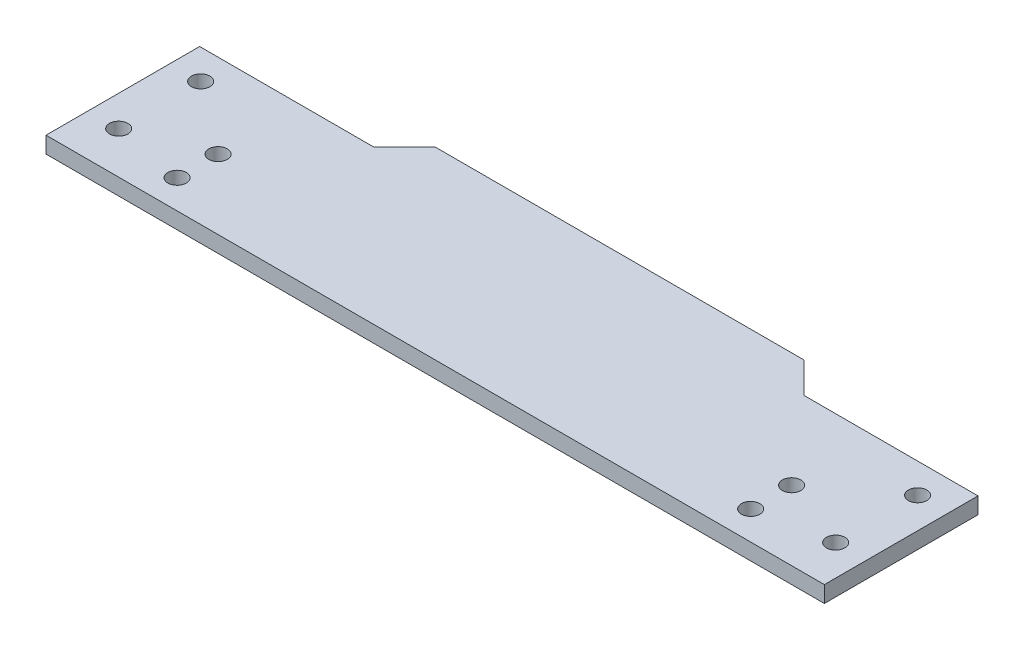
ISO-10303-21;
HEADER;
FILE_DESCRIPTION(('STEP AP214'),'2;1');
FILE_NAME('part.step','',(''),(''),'','','');
FILE_SCHEMA(('AUTOMOTIVE_DESIGN { 1 0 10303 214 1 1 1 1 }'));
ENDSEC;
DATA;
#1=APPLICATION_CONTEXT('core data for automotive mechanical design processes');
#2=APPLICATION_PROTOCOL_DEFINITION('international standard','automotive_design',2000,#1);
#3=PRODUCT_CONTEXT('',#1,'mechanical');
#4=PRODUCT('Part','Part','',(#3));
#5=PRODUCT_RELATED_PRODUCT_CATEGORY('part','',(#4));
#6=PRODUCT_DEFINITION_FORMATION('','',#4);
#7=PRODUCT_DEFINITION_CONTEXT('part definition',#1,'design');
#8=PRODUCT_DEFINITION('design','',#6,#7);
#9=PRODUCT_DEFINITION_SHAPE('','',#8);
#10=(LENGTH_UNIT() NAMED_UNIT(*) SI_UNIT(.MILLI.,.METRE.));
#11=(NAMED_UNIT(*) PLANE_ANGLE_UNIT() SI_UNIT($,.RADIAN.));
#12=(NAMED_UNIT(*) SI_UNIT($,.STERADIAN.) SOLID_ANGLE_UNIT());
#13=UNCERTAINTY_MEASURE_WITH_UNIT(LENGTH_MEASURE(1.E-05),#10,'distance_accuracy_value','');
#14=(GEOMETRIC_REPRESENTATION_CONTEXT(3) GLOBAL_UNCERTAINTY_ASSIGNED_CONTEXT((#13)) GLOBAL_UNIT_ASSIGNED_CONTEXT((#10,
#11,#12)) REPRESENTATION_CONTEXT('',''));
#15=CARTESIAN_POINT('',(0.,0.,0.));
#16=DIRECTION('',(0.,0.,1.));
#17=DIRECTION('',(1.,0.,0.));
#18=AXIS2_PLACEMENT_3D('',#15,#16,#17);
#19=CARTESIAN_POINT('',(-190.,8.,0.));
#20=DIRECTION('',(-1.,0.,0.));
#21=DIRECTION('',(0.,0.,1.));
#22=AXIS2_PLACEMENT_3D('',#19,#20,#21);
#23=PLANE('',#22);
#24=DIRECTION('',(0.,0.,-1.));
#25=VECTOR('',#24,1.);
#26=CARTESIAN_POINT('',(-190.,0.,0.));
#27=LINE('',#26,#25);
#28=CARTESIAN_POINT('',(-190.,0.,0.));
#29=VERTEX_POINT('',#28);
#30=CARTESIAN_POINT('',(-190.,0.,-75.));
#31=VERTEX_POINT('',#30);
#32=EDGE_CURVE('E153',#29,#31,#27,.T.);
#33=ORIENTED_EDGE('',*,*,#32,.F.);
#34=DIRECTION('',(0.,-1.,0.));
#35=VECTOR('',#34,1.);
#36=CARTESIAN_POINT('',(-190.,8.,0.));
#37=LINE('',#36,#35);
#38=CARTESIAN_POINT('',(-190.,8.,0.));
#39=VERTEX_POINT('',#38);
#40=EDGE_CURVE('E11',#39,#29,#37,.T.);
#41=ORIENTED_EDGE('',*,*,#40,.F.);
#42=DIRECTION('',(0.,0.,-1.));
#43=VECTOR('',#42,1.);
#44=CARTESIAN_POINT('',(-190.,8.,0.));
#45=LINE('',#44,#43);
#46=CARTESIAN_POINT('',(-190.,8.,-75.));
#47=VERTEX_POINT('',#46);
#48=EDGE_CURVE('E398',#39,#47,#45,.T.);
#49=ORIENTED_EDGE('',*,*,#48,.T.);
#50=DIRECTION('',(0.,-1.,0.));
#51=VECTOR('',#50,1.);
#52=CARTESIAN_POINT('',(-190.,8.,-75.));
#53=LINE('',#52,#51);
#54=EDGE_CURVE('E51',#47,#31,#53,.T.);
#55=ORIENTED_EDGE('',*,*,#54,.T.);
#56=EDGE_LOOP('',(#33,#41,#49,#55));
#57=FACE_BOUND('',#56,.T.);
#58=ADVANCED_FACE('F34',(#57),#23,.T.);
#59=CARTESIAN_POINT('',(0.,8.,0.));
#60=DIRECTION('',(0.,0.,-1.));
#61=DIRECTION('',(-1.,0.,0.));
#62=AXIS2_PLACEMENT_3D('',#59,#60,#61);
#63=PLANE('',#62);
#64=DIRECTION('',(1.,0.,0.));
#65=VECTOR('',#64,1.);
#66=CARTESIAN_POINT('',(0.,0.,0.));
#67=LINE('',#66,#65);
#68=CARTESIAN_POINT('',(190.,0.,0.));
#69=VERTEX_POINT('',#68);
#70=EDGE_CURVE('E155',#29,#69,#67,.T.);
#71=ORIENTED_EDGE('',*,*,#70,.T.);
#72=DIRECTION('',(0.,-1.,0.));
#73=VECTOR('',#72,1.);
#74=CARTESIAN_POINT('',(190.,8.,0.));
#75=LINE('',#74,#73);
#76=CARTESIAN_POINT('',(190.,8.,0.));
#77=VERTEX_POINT('',#76);
#78=EDGE_CURVE('E43',#77,#69,#75,.T.);
#79=ORIENTED_EDGE('',*,*,#78,.F.);
#80=DIRECTION('',(1.,0.,0.));
#81=VECTOR('',#80,1.);
#82=CARTESIAN_POINT('',(0.,8.,0.));
#83=LINE('',#82,#81);
#84=EDGE_CURVE('E394',#39,#77,#83,.T.);
#85=ORIENTED_EDGE('',*,*,#84,.F.);
#86=ORIENTED_EDGE('',*,*,#40,.T.);
#87=EDGE_LOOP('',(#71,#79,#85,#86));
#88=FACE_BOUND('',#87,.T.);
#89=ADVANCED_FACE('F210',(#88),#63,.F.);
#90=CARTESIAN_POINT('',(190.,8.,0.));
#91=DIRECTION('',(-1.,0.,0.));
#92=DIRECTION('',(0.,0.,1.));
#93=AXIS2_PLACEMENT_3D('',#90,#91,#92);
#94=PLANE('',#93);
#95=DIRECTION('',(0.,0.,-1.));
#96=VECTOR('',#95,1.);
#97=CARTESIAN_POINT('',(190.,0.,0.));
#98=LINE('',#97,#96);
#99=CARTESIAN_POINT('',(190.,0.,-75.));
#100=VERTEX_POINT('',#99);
#101=EDGE_CURVE('E158',#69,#100,#98,.T.);
#102=ORIENTED_EDGE('',*,*,#101,.T.);
#103=DIRECTION('',(0.,-1.,0.));
#104=VECTOR('',#103,1.);
#105=CARTESIAN_POINT('',(190.,8.,-75.));
#106=LINE('',#105,#104);
#107=CARTESIAN_POINT('',(190.,8.,-75.));
#108=VERTEX_POINT('',#107);
#109=EDGE_CURVE('E198',#108,#100,#106,.T.);
#110=ORIENTED_EDGE('',*,*,#109,.F.);
#111=DIRECTION('',(0.,0.,-1.));
#112=VECTOR('',#111,1.);
#113=CARTESIAN_POINT('',(190.,8.,0.));
#114=LINE('',#113,#112);
#115=EDGE_CURVE('E206',#77,#108,#114,.T.);
#116=ORIENTED_EDGE('',*,*,#115,.F.);
#117=ORIENTED_EDGE('',*,*,#78,.T.);
#118=EDGE_LOOP('',(#102,#110,#116,#117));
#119=FACE_BOUND('',#118,.T.);
#120=ADVANCED_FACE('F203',(#119),#94,.F.);
#121=CARTESIAN_POINT('',(0.,8.,-75.));
#122=DIRECTION('',(0.,0.,1.));
#123=DIRECTION('',(1.,0.,0.));
#124=AXIS2_PLACEMENT_3D('',#121,#122,#123);
#125=PLANE('',#124);
#126=DIRECTION('',(-1.,0.,0.));
#127=VECTOR('',#126,1.);
#128=CARTESIAN_POINT('',(0.,0.,-75.));
#129=LINE('',#128,#127);
#130=CARTESIAN_POINT('',(105.,0.,-75.));
#131=VERTEX_POINT('',#130);
#132=EDGE_CURVE('E161',#100,#131,#129,.T.);
#133=ORIENTED_EDGE('',*,*,#132,.T.);
#134=DIRECTION('',(0.,-1.,0.));
#135=VECTOR('',#134,1.);
#136=CARTESIAN_POINT('',(105.,8.,-75.));
#137=LINE('',#136,#135);
#138=CARTESIAN_POINT('',(105.,8.,-75.));
#139=VERTEX_POINT('',#138);
#140=EDGE_CURVE('E195',#139,#131,#137,.T.);
#141=ORIENTED_EDGE('',*,*,#140,.F.);
#142=DIRECTION('',(-1.,0.,0.));
#143=VECTOR('',#142,1.);
#144=CARTESIAN_POINT('',(0.,8.,-75.));
#145=LINE('',#144,#143);
#146=EDGE_CURVE('E392',#108,#139,#145,.T.);
#147=ORIENTED_EDGE('',*,*,#146,.F.);
#148=ORIENTED_EDGE('',*,*,#109,.T.);
#149=EDGE_LOOP('',(#133,#141,#147,#148));
#150=FACE_BOUND('',#149,.T.);
#151=ADVANCED_FACE('F278',(#150),#125,.F.);
#152=CARTESIAN_POINT('',(90.,8.,-90.));
#153=DIRECTION('',(-0.707106781186547,0.,0.707106781186547));
#154=DIRECTION('',(0.707106781186548,0.,0.707106781186548));
#155=AXIS2_PLACEMENT_3D('',#152,#153,#154);
#156=PLANE('',#155);
#157=DIRECTION('',(-0.707106781186548,0.,-0.707106781186548));
#158=VECTOR('',#157,1.);
#159=CARTESIAN_POINT('',(90.,0.,-90.));
#160=LINE('',#159,#158);
#161=CARTESIAN_POINT('',(90.,0.,-90.));
#162=VERTEX_POINT('',#161);
#163=EDGE_CURVE('E164',#131,#162,#160,.T.);
#164=ORIENTED_EDGE('',*,*,#163,.T.);
#165=DIRECTION('',(0.,-1.,0.));
#166=VECTOR('',#165,1.);
#167=CARTESIAN_POINT('',(90.,8.,-90.));
#168=LINE('',#167,#166);
#169=CARTESIAN_POINT('',(90.,8.,-90.));
#170=VERTEX_POINT('',#169);
#171=EDGE_CURVE('E121',#170,#162,#168,.T.);
#172=ORIENTED_EDGE('',*,*,#171,.F.);
#173=DIRECTION('',(-0.707106781186548,0.,-0.707106781186548));
#174=VECTOR('',#173,1.);
#175=CARTESIAN_POINT('',(90.,8.,-90.));
#176=LINE('',#175,#174);
#177=EDGE_CURVE('E110',#139,#170,#176,.T.);
#178=ORIENTED_EDGE('',*,*,#177,.F.);
#179=ORIENTED_EDGE('',*,*,#140,.T.);
#180=EDGE_LOOP('',(#164,#172,#178,#179));
#181=FACE_BOUND('',#180,.T.);
#182=ADVANCED_FACE('F275',(#181),#156,.F.);
#183=CARTESIAN_POINT('',(0.,8.,-90.));
#184=DIRECTION('',(0.,0.,1.));
#185=DIRECTION('',(1.,0.,0.));
#186=AXIS2_PLACEMENT_3D('',#183,#184,#185);
#187=PLANE('',#186);
#188=DIRECTION('',(-1.,0.,0.));
#189=VECTOR('',#188,1.);
#190=CARTESIAN_POINT('',(0.,0.,-90.));
#191=LINE('',#190,#189);
#192=CARTESIAN_POINT('',(-90.,0.,-90.));
#193=VERTEX_POINT('',#192);
#194=EDGE_CURVE('E118',#162,#193,#191,.T.);
#195=ORIENTED_EDGE('',*,*,#194,.T.);
#196=DIRECTION('',(0.,-1.,0.));
#197=VECTOR('',#196,1.);
#198=CARTESIAN_POINT('',(-90.,8.,-90.));
#199=LINE('',#198,#197);
#200=CARTESIAN_POINT('',(-90.,8.,-90.));
#201=VERTEX_POINT('',#200);
#202=EDGE_CURVE('E116',#201,#193,#199,.T.);
#203=ORIENTED_EDGE('',*,*,#202,.F.);
#204=DIRECTION('',(-1.,0.,0.));
#205=VECTOR('',#204,1.);
#206=CARTESIAN_POINT('',(0.,8.,-90.));
#207=LINE('',#206,#205);
#208=EDGE_CURVE('E101',#170,#201,#207,.T.);
#209=ORIENTED_EDGE('',*,*,#208,.F.);
#210=ORIENTED_EDGE('',*,*,#171,.T.);
#211=EDGE_LOOP('',(#195,#203,#209,#210));
#212=FACE_BOUND('',#211,.T.);
#213=ADVANCED_FACE('F117',(#212),#187,.F.);
#214=CARTESIAN_POINT('',(-90.,8.,-90.));
#215=DIRECTION('',(-0.707106781186547,0.,-0.707106781186547));
#216=DIRECTION('',(-0.707106781186548,0.,0.707106781186548));
#217=AXIS2_PLACEMENT_3D('',#214,#215,#216);
#218=PLANE('',#217);
#219=DIRECTION('',(0.707106781186548,0.,-0.707106781186548));
#220=VECTOR('',#219,1.);
#221=CARTESIAN_POINT('',(-90.,0.,-90.));
#222=LINE('',#221,#220);
#223=CARTESIAN_POINT('',(-105.,0.,-75.));
#224=VERTEX_POINT('',#223);
#225=EDGE_CURVE('E168',#224,#193,#222,.T.);
#226=ORIENTED_EDGE('',*,*,#225,.F.);
#227=DIRECTION('',(0.,-1.,0.));
#228=VECTOR('',#227,1.);
#229=CARTESIAN_POINT('',(-105.,8.,-75.));
#230=LINE('',#229,#228);
#231=CARTESIAN_POINT('',(-105.,8.,-75.));
#232=VERTEX_POINT('',#231);
#233=EDGE_CURVE('E76',#232,#224,#230,.T.);
#234=ORIENTED_EDGE('',*,*,#233,.F.);
#235=DIRECTION('',(0.707106781186548,0.,-0.707106781186548));
#236=VECTOR('',#235,1.);
#237=CARTESIAN_POINT('',(-90.,8.,-90.));
#238=LINE('',#237,#236);
#239=EDGE_CURVE('E108',#232,#201,#238,.T.);
#240=ORIENTED_EDGE('',*,*,#239,.T.);
#241=ORIENTED_EDGE('',*,*,#202,.T.);
#242=EDGE_LOOP('',(#226,#234,#240,#241));
#243=FACE_BOUND('',#242,.T.);
#244=ADVANCED_FACE('F123',(#243),#218,.T.);
#245=CARTESIAN_POINT('',(140.,8.,-34.));
#246=DIRECTION('',(0.,-1.,0.));
#247=DIRECTION('',(0.,0.,-1.));
#248=AXIS2_PLACEMENT_3D('',#245,#246,#247);
#249=CYLINDRICAL_SURFACE('',#248,4.49999999999999);
#250=CARTESIAN_POINT('',(140.,8.,-34.));
#251=DIRECTION('',(0.,1.,0.));
#252=DIRECTION('',(0.,0.,1.));
#253=AXIS2_PLACEMENT_3D('',#250,#251,#252);
#254=CIRCLE('',#253,4.49999999999999);
#255=CARTESIAN_POINT('',(140.,8.,-29.5));
#256=VERTEX_POINT('',#255);
#257=EDGE_CURVE('E141',#256,#256,#254,.T.);
#258=ORIENTED_EDGE('',*,*,#257,.T.);
#259=EDGE_LOOP('',(#258));
#260=FACE_BOUND('',#259,.T.);
#261=CARTESIAN_POINT('',(140.,0.,-34.));
#262=DIRECTION('',(0.,1.,0.));
#263=DIRECTION('',(0.,0.,1.));
#264=AXIS2_PLACEMENT_3D('',#261,#262,#263);
#265=CIRCLE('',#264,4.49999999999999);
#266=CARTESIAN_POINT('',(140.,0.,-29.5));
#267=VERTEX_POINT('',#266);
#268=EDGE_CURVE('E185',#267,#267,#265,.T.);
#269=ORIENTED_EDGE('',*,*,#268,.F.);
#270=EDGE_LOOP('',(#269));
#271=FACE_BOUND('',#270,.T.);
#272=ADVANCED_FACE('F252',(#260,#271),#249,.F.);
#273=CARTESIAN_POINT('',(175.,8.,-20.5));
#274=DIRECTION('',(0.,-1.,0.));
#275=DIRECTION('',(0.,0.,-1.));
#276=AXIS2_PLACEMENT_3D('',#273,#274,#275);
#277=CYLINDRICAL_SURFACE('',#276,4.49999999999999);
#278=CARTESIAN_POINT('',(175.,8.,-20.5));
#279=DIRECTION('',(0.,1.,0.));
#280=DIRECTION('',(0.,0.,1.));
#281=AXIS2_PLACEMENT_3D('',#278,#279,#280);
#282=CIRCLE('',#281,4.49999999999999);
#283=CARTESIAN_POINT('',(175.,8.,-16.));
#284=VERTEX_POINT('',#283);
#285=EDGE_CURVE('E138',#284,#284,#282,.T.);
#286=ORIENTED_EDGE('',*,*,#285,.T.);
#287=EDGE_LOOP('',(#286));
#288=FACE_BOUND('',#287,.T.);
#289=CARTESIAN_POINT('',(175.,0.,-20.5));
#290=DIRECTION('',(0.,1.,0.));
#291=DIRECTION('',(0.,0.,1.));
#292=AXIS2_PLACEMENT_3D('',#289,#290,#291);
#293=CIRCLE('',#292,4.49999999999999);
#294=CARTESIAN_POINT('',(175.,0.,-16.));
#295=VERTEX_POINT('',#294);
#296=EDGE_CURVE('E182',#295,#295,#293,.T.);
#297=ORIENTED_EDGE('',*,*,#296,.F.);
#298=EDGE_LOOP('',(#297));
#299=FACE_BOUND('',#298,.T.);
#300=ADVANCED_FACE('F255',(#288,#299),#277,.F.);
#301=CARTESIAN_POINT('',(175.,8.,-60.5));
#302=DIRECTION('',(0.,-1.,0.));
#303=DIRECTION('',(0.,0.,-1.));
#304=AXIS2_PLACEMENT_3D('',#301,#302,#303);
#305=CYLINDRICAL_SURFACE('',#304,4.49999999999999);
#306=CARTESIAN_POINT('',(175.,8.,-60.5));
#307=DIRECTION('',(0.,1.,0.));
#308=DIRECTION('',(0.,0.,1.));
#309=AXIS2_PLACEMENT_3D('',#306,#307,#308);
#310=CIRCLE('',#309,4.49999999999999);
#311=CARTESIAN_POINT('',(175.,8.,-56.));
#312=VERTEX_POINT('',#311);
#313=EDGE_CURVE('E135',#312,#312,#310,.T.);
#314=ORIENTED_EDGE('',*,*,#313,.T.);
#315=EDGE_LOOP('',(#314));
#316=FACE_BOUND('',#315,.T.);
#317=CARTESIAN_POINT('',(175.,0.,-60.5));
#318=DIRECTION('',(0.,1.,0.));
#319=DIRECTION('',(0.,0.,1.));
#320=AXIS2_PLACEMENT_3D('',#317,#318,#319);
#321=CIRCLE('',#320,4.49999999999999);
#322=CARTESIAN_POINT('',(175.,0.,-56.));
#323=VERTEX_POINT('',#322);
#324=EDGE_CURVE('E179',#323,#323,#321,.T.);
#325=ORIENTED_EDGE('',*,*,#324,.F.);
#326=EDGE_LOOP('',(#325));
#327=FACE_BOUND('',#326,.T.);
#328=ADVANCED_FACE('F259',(#316,#327),#305,.F.);
#329=CARTESIAN_POINT('',(-140.,8.,-14.));
#330=DIRECTION('',(0.,-1.,0.));
#331=DIRECTION('',(0.,0.,-1.));
#332=AXIS2_PLACEMENT_3D('',#329,#330,#331);
#333=CYLINDRICAL_SURFACE('',#332,4.49999999999999);
#334=CARTESIAN_POINT('',(-140.,8.,-14.));
#335=DIRECTION('',(0.,1.,0.));
#336=DIRECTION('',(0.,0.,1.));
#337=AXIS2_PLACEMENT_3D('',#334,#335,#336);
#338=CIRCLE('',#337,4.49999999999999);
#339=CARTESIAN_POINT('',(-140.,8.,-9.50000000000001));
#340=VERTEX_POINT('',#339);
#341=EDGE_CURVE('E132',#340,#340,#338,.F.);
#342=ORIENTED_EDGE('',*,*,#341,.F.);
#343=EDGE_LOOP('',(#342));
#344=FACE_BOUND('',#343,.T.);
#345=CARTESIAN_POINT('',(-140.,0.,-14.));
#346=DIRECTION('',(0.,1.,0.));
#347=DIRECTION('',(0.,0.,1.));
#348=AXIS2_PLACEMENT_3D('',#345,#346,#347);
#349=CIRCLE('',#348,4.49999999999999);
#350=CARTESIAN_POINT('',(-140.,0.,-9.50000000000001));
#351=VERTEX_POINT('',#350);
#352=EDGE_CURVE('E176',#351,#351,#349,.F.);
#353=ORIENTED_EDGE('',*,*,#352,.T.);
#354=EDGE_LOOP('',(#353));
#355=FACE_BOUND('',#354,.T.);
#356=ADVANCED_FACE('F263',(#344,#355),#333,.F.);
#357=CARTESIAN_POINT('',(-175.,8.,-20.5));
#358=DIRECTION('',(0.,-1.,0.));
#359=DIRECTION('',(0.,0.,-1.));
#360=AXIS2_PLACEMENT_3D('',#357,#358,#359);
#361=CYLINDRICAL_SURFACE('',#360,4.49999999999999);
#362=CARTESIAN_POINT('',(-175.,8.,-20.5));
#363=DIRECTION('',(0.,1.,0.));
#364=DIRECTION('',(0.,0.,1.));
#365=AXIS2_PLACEMENT_3D('',#362,#363,#364);
#366=CIRCLE('',#365,4.49999999999999);
#367=CARTESIAN_POINT('',(-175.,8.,-16.));
#368=VERTEX_POINT('',#367);
#369=EDGE_CURVE('E126',#368,#368,#366,.F.);
#370=ORIENTED_EDGE('',*,*,#369,.F.);
#371=EDGE_LOOP('',(#370));
#372=FACE_BOUND('',#371,.T.);
#373=CARTESIAN_POINT('',(-175.,0.,-20.5));
#374=DIRECTION('',(0.,1.,0.));
#375=DIRECTION('',(0.,0.,1.));
#376=AXIS2_PLACEMENT_3D('',#373,#374,#375);
#377=CIRCLE('',#376,4.49999999999999);
#378=CARTESIAN_POINT('',(-175.,0.,-16.));
#379=VERTEX_POINT('',#378);
#380=EDGE_CURVE('E173',#379,#379,#377,.F.);
#381=ORIENTED_EDGE('',*,*,#380,.T.);
#382=EDGE_LOOP('',(#381));
#383=FACE_BOUND('',#382,.T.);
#384=ADVANCED_FACE('F231',(#372,#383),#361,.F.);
#385=CARTESIAN_POINT('',(0.,8.,-75.));
#386=DIRECTION('',(0.,0.,-1.));
#387=DIRECTION('',(-1.,0.,0.));
#388=AXIS2_PLACEMENT_3D('',#385,#386,#387);
#389=PLANE('',#388);
#390=DIRECTION('',(1.,0.,0.));
#391=VECTOR('',#390,1.);
#392=CARTESIAN_POINT('',(0.,0.,-75.));
#393=LINE('',#392,#391);
#394=EDGE_CURVE('E170',#31,#224,#393,.T.);
#395=ORIENTED_EDGE('',*,*,#394,.F.);
#396=ORIENTED_EDGE('',*,*,#54,.F.);
#397=DIRECTION('',(1.,0.,0.));
#398=VECTOR('',#397,1.);
#399=CARTESIAN_POINT('',(0.,8.,-75.));
#400=LINE('',#399,#398);
#401=EDGE_CURVE('E124',#47,#232,#400,.T.);
#402=ORIENTED_EDGE('',*,*,#401,.T.);
#403=ORIENTED_EDGE('',*,*,#233,.T.);
#404=EDGE_LOOP('',(#395,#396,#402,#403));
#405=FACE_BOUND('',#404,.T.);
#406=ADVANCED_FACE('F223',(#405),#389,.T.);
#407=CARTESIAN_POINT('',(-175.,8.,-60.5));
#408=DIRECTION('',(0.,-1.,0.));
#409=DIRECTION('',(0.,0.,-1.));
#410=AXIS2_PLACEMENT_3D('',#407,#408,#409);
#411=CYLINDRICAL_SURFACE('',#410,4.49999999999999);
#412=CARTESIAN_POINT('',(-175.,8.,-60.5));
#413=DIRECTION('',(0.,1.,0.));
#414=DIRECTION('',(0.,0.,1.));
#415=AXIS2_PLACEMENT_3D('',#412,#413,#414);
#416=CIRCLE('',#415,4.49999999999999);
#417=CARTESIAN_POINT('',(-175.,8.,-56.));
#418=VERTEX_POINT('',#417);
#419=EDGE_CURVE('E236',#418,#418,#416,.F.);
#420=ORIENTED_EDGE('',*,*,#419,.F.);
#421=EDGE_LOOP('',(#420));
#422=FACE_BOUND('',#421,.T.);
#423=CARTESIAN_POINT('',(-175.,0.,-60.5));
#424=DIRECTION('',(0.,1.,0.));
#425=DIRECTION('',(0.,0.,1.));
#426=AXIS2_PLACEMENT_3D('',#423,#424,#425);
#427=CIRCLE('',#426,4.49999999999999);
#428=CARTESIAN_POINT('',(-175.,0.,-56.));
#429=VERTEX_POINT('',#428);
#430=EDGE_CURVE('E150',#429,#429,#427,.F.);
#431=ORIENTED_EDGE('',*,*,#430,.T.);
#432=EDGE_LOOP('',(#431));
#433=FACE_BOUND('',#432,.T.);
#434=ADVANCED_FACE('F221',(#422,#433),#411,.F.);
#435=CARTESIAN_POINT('',(-140.,8.,-34.));
#436=DIRECTION('',(0.,-1.,0.));
#437=DIRECTION('',(0.,0.,-1.));
#438=AXIS2_PLACEMENT_3D('',#435,#436,#437);
#439=CYLINDRICAL_SURFACE('',#438,4.49999999999999);
#440=CARTESIAN_POINT('',(-140.,8.,-34.));
#441=DIRECTION('',(0.,1.,0.));
#442=DIRECTION('',(0.,0.,1.));
#443=AXIS2_PLACEMENT_3D('',#440,#441,#442);
#444=CIRCLE('',#443,4.49999999999999);
#445=CARTESIAN_POINT('',(-140.,8.,-29.5));
#446=VERTEX_POINT('',#445);
#447=EDGE_CURVE('E191',#446,#446,#444,.F.);
#448=ORIENTED_EDGE('',*,*,#447,.F.);
#449=EDGE_LOOP('',(#448));
#450=FACE_BOUND('',#449,.T.);
#451=CARTESIAN_POINT('',(-140.,0.,-34.));
#452=DIRECTION('',(0.,1.,0.));
#453=DIRECTION('',(0.,0.,1.));
#454=AXIS2_PLACEMENT_3D('',#451,#452,#453);
#455=CIRCLE('',#454,4.49999999999999);
#456=CARTESIAN_POINT('',(-140.,0.,-29.5));
#457=VERTEX_POINT('',#456);
#458=EDGE_CURVE('E147',#457,#457,#455,.F.);
#459=ORIENTED_EDGE('',*,*,#458,.T.);
#460=EDGE_LOOP('',(#459));
#461=FACE_BOUND('',#460,.T.);
#462=ADVANCED_FACE('F36',(#450,#461),#439,.F.);
#463=CARTESIAN_POINT('',(140.,8.,-14.));
#464=DIRECTION('',(0.,-1.,0.));
#465=DIRECTION('',(0.,0.,-1.));
#466=AXIS2_PLACEMENT_3D('',#463,#464,#465);
#467=CYLINDRICAL_SURFACE('',#466,4.49999999999999);
#468=CARTESIAN_POINT('',(140.,8.,-14.));
#469=DIRECTION('',(0.,1.,0.));
#470=DIRECTION('',(0.,0.,1.));
#471=AXIS2_PLACEMENT_3D('',#468,#469,#470);
#472=CIRCLE('',#471,4.49999999999999);
#473=CARTESIAN_POINT('',(140.,8.,-9.50000000000001));
#474=VERTEX_POINT('',#473);
#475=EDGE_CURVE('E144',#474,#474,#472,.T.);
#476=ORIENTED_EDGE('',*,*,#475,.T.);
#477=EDGE_LOOP('',(#476));
#478=FACE_BOUND('',#477,.T.);
#479=CARTESIAN_POINT('',(140.,0.,-14.));
#480=DIRECTION('',(0.,1.,0.));
#481=DIRECTION('',(0.,0.,1.));
#482=AXIS2_PLACEMENT_3D('',#479,#480,#481);
#483=CIRCLE('',#482,4.49999999999999);
#484=CARTESIAN_POINT('',(140.,0.,-9.50000000000001));
#485=VERTEX_POINT('',#484);
#486=EDGE_CURVE('E188',#485,#485,#483,.T.);
#487=ORIENTED_EDGE('',*,*,#486,.F.);
#488=EDGE_LOOP('',(#487));
#489=FACE_BOUND('',#488,.T.);
#490=ADVANCED_FACE('F229',(#478,#489),#467,.F.);
#491=CARTESIAN_POINT('',(0.,8.,0.));
#492=DIRECTION('',(0.,1.,0.));
#493=DIRECTION('',(0.,0.,1.));
#494=AXIS2_PLACEMENT_3D('',#491,#492,#493);
#495=PLANE('',#494);
#496=ORIENTED_EDGE('',*,*,#447,.T.);
#497=EDGE_LOOP('',(#496));
#498=FACE_BOUND('',#497,.T.);
#499=ORIENTED_EDGE('',*,*,#419,.T.);
#500=EDGE_LOOP('',(#499));
#501=FACE_BOUND('',#500,.T.);
#502=ORIENTED_EDGE('',*,*,#48,.F.);
#503=ORIENTED_EDGE('',*,*,#84,.T.);
#504=ORIENTED_EDGE('',*,*,#115,.T.);
#505=ORIENTED_EDGE('',*,*,#146,.T.);
#506=ORIENTED_EDGE('',*,*,#177,.T.);
#507=ORIENTED_EDGE('',*,*,#208,.T.);
#508=ORIENTED_EDGE('',*,*,#239,.F.);
#509=ORIENTED_EDGE('',*,*,#401,.F.);
#510=EDGE_LOOP('',(#502,#503,#504,#505,#506,#507,#508,#509));
#511=FACE_BOUND('',#510,.T.);
#512=ORIENTED_EDGE('',*,*,#369,.T.);
#513=EDGE_LOOP('',(#512));
#514=FACE_BOUND('',#513,.T.);
#515=ORIENTED_EDGE('',*,*,#341,.T.);
#516=EDGE_LOOP('',(#515));
#517=FACE_BOUND('',#516,.T.);
#518=ORIENTED_EDGE('',*,*,#313,.F.);
#519=EDGE_LOOP('',(#518));
#520=FACE_BOUND('',#519,.T.);
#521=ORIENTED_EDGE('',*,*,#285,.F.);
#522=EDGE_LOOP('',(#521));
#523=FACE_BOUND('',#522,.T.);
#524=ORIENTED_EDGE('',*,*,#257,.F.);
#525=EDGE_LOOP('',(#524));
#526=FACE_BOUND('',#525,.T.);
#527=ORIENTED_EDGE('',*,*,#475,.F.);
#528=EDGE_LOOP('',(#527));
#529=FACE_BOUND('',#528,.T.);
#530=ADVANCED_FACE('F104',(#498,#501,#511,#514,#517,#520,#523,#526,#529),#495,.T.);
#531=CARTESIAN_POINT('',(0.,0.,0.));
#532=DIRECTION('',(0.,1.,0.));
#533=DIRECTION('',(0.,0.,1.));
#534=AXIS2_PLACEMENT_3D('',#531,#532,#533);
#535=PLANE('',#534);
#536=ORIENTED_EDGE('',*,*,#458,.F.);
#537=EDGE_LOOP('',(#536));
#538=FACE_BOUND('',#537,.T.);
#539=ORIENTED_EDGE('',*,*,#430,.F.);
#540=EDGE_LOOP('',(#539));
#541=FACE_BOUND('',#540,.T.);
#542=ORIENTED_EDGE('',*,*,#32,.T.);
#543=ORIENTED_EDGE('',*,*,#394,.T.);
#544=ORIENTED_EDGE('',*,*,#225,.T.);
#545=ORIENTED_EDGE('',*,*,#194,.F.);
#546=ORIENTED_EDGE('',*,*,#163,.F.);
#547=ORIENTED_EDGE('',*,*,#132,.F.);
#548=ORIENTED_EDGE('',*,*,#101,.F.);
#549=ORIENTED_EDGE('',*,*,#70,.F.);
#550=EDGE_LOOP('',(#542,#543,#544,#545,#546,#547,#548,#549));
#551=FACE_BOUND('',#550,.T.);
#552=ORIENTED_EDGE('',*,*,#380,.F.);
#553=EDGE_LOOP('',(#552));
#554=FACE_BOUND('',#553,.T.);
#555=ORIENTED_EDGE('',*,*,#352,.F.);
#556=EDGE_LOOP('',(#555));
#557=FACE_BOUND('',#556,.T.);
#558=ORIENTED_EDGE('',*,*,#324,.T.);
#559=EDGE_LOOP('',(#558));
#560=FACE_BOUND('',#559,.T.);
#561=ORIENTED_EDGE('',*,*,#296,.T.);
#562=EDGE_LOOP('',(#561));
#563=FACE_BOUND('',#562,.T.);
#564=ORIENTED_EDGE('',*,*,#268,.T.);
#565=EDGE_LOOP('',(#564));
#566=FACE_BOUND('',#565,.T.);
#567=ORIENTED_EDGE('',*,*,#486,.T.);
#568=EDGE_LOOP('',(#567));
#569=FACE_BOUND('',#568,.T.);
#570=ADVANCED_FACE('F212',(#538,#541,#551,#554,#557,#560,#563,#566,#569),#535,.F.);
#571=CLOSED_SHELL('',(#58,#89,#120,#151,#182,#213,#244,#272,#300,#328,#356,#384,#406,#434,#462,
#490,#530,#570));
#572=MANIFOLD_SOLID_BREP('B2',#571);
#573=ADVANCED_BREP_SHAPE_REPRESENTATION('',(#18,#572),#14);
#574=SHAPE_DEFINITION_REPRESENTATION(#9,#573);
ENDSEC;
END-ISO-10303-21;
